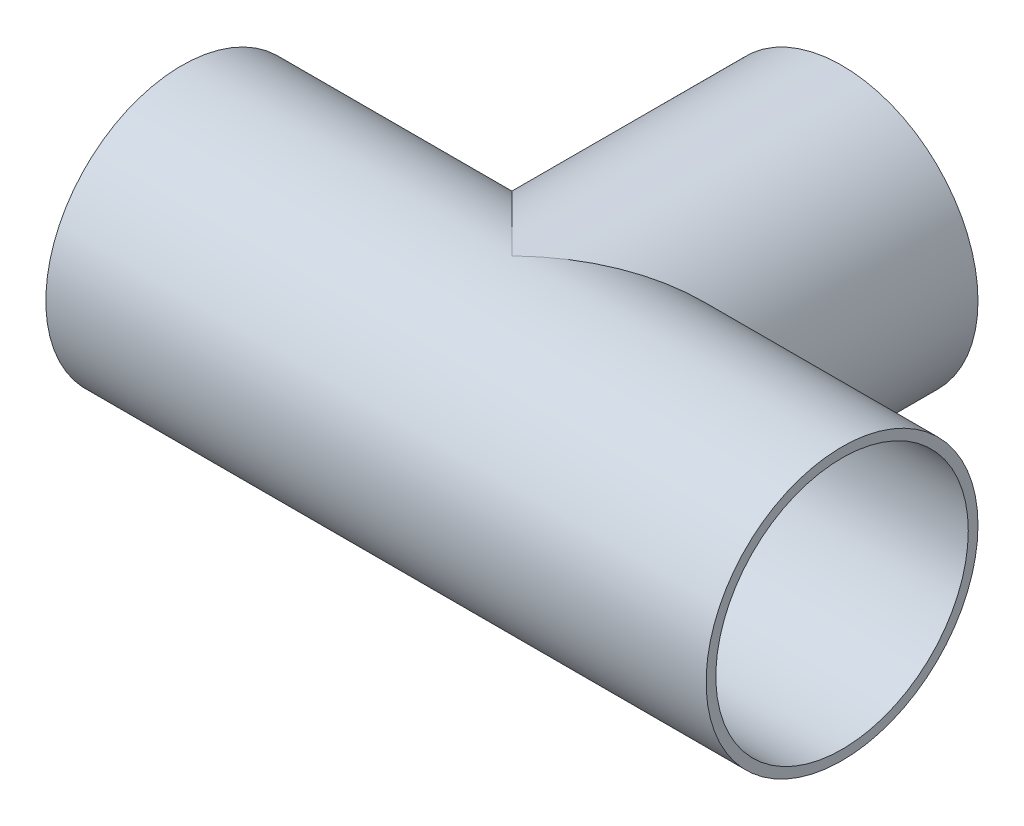
ISO-10303-21;
HEADER;
FILE_DESCRIPTION(('STEP AP214'),'2;1');
FILE_NAME('part.step','',(''),(''),'','','');
FILE_SCHEMA(('AUTOMOTIVE_DESIGN { 1 0 10303 214 1 1 1 1 }'));
ENDSEC;
DATA;
#1=APPLICATION_CONTEXT('core data for automotive mechanical design processes');
#2=APPLICATION_PROTOCOL_DEFINITION('international standard','automotive_design',2000,#1);
#3=PRODUCT_CONTEXT('',#1,'mechanical');
#4=PRODUCT('Part','Part','',(#3));
#5=PRODUCT_RELATED_PRODUCT_CATEGORY('part','',(#4));
#6=PRODUCT_DEFINITION_FORMATION('','',#4);
#7=PRODUCT_DEFINITION_CONTEXT('part definition',#1,'design');
#8=PRODUCT_DEFINITION('design','',#6,#7);
#9=PRODUCT_DEFINITION_SHAPE('','',#8);
#10=(LENGTH_UNIT() NAMED_UNIT(*) SI_UNIT(.MILLI.,.METRE.));
#11=(NAMED_UNIT(*) PLANE_ANGLE_UNIT() SI_UNIT($,.RADIAN.));
#12=(NAMED_UNIT(*) SI_UNIT($,.STERADIAN.) SOLID_ANGLE_UNIT());
#13=UNCERTAINTY_MEASURE_WITH_UNIT(LENGTH_MEASURE(1.E-05),#10,'distance_accuracy_value','');
#14=(GEOMETRIC_REPRESENTATION_CONTEXT(3) GLOBAL_UNCERTAINTY_ASSIGNED_CONTEXT((#13)) GLOBAL_UNIT_ASSIGNED_CONTEXT((#10,
#11,#12)) REPRESENTATION_CONTEXT('',''));
#15=CARTESIAN_POINT('',(0.,0.,0.));
#16=DIRECTION('',(0.,0.,1.));
#17=DIRECTION('',(1.,0.,0.));
#18=AXIS2_PLACEMENT_3D('',#15,#16,#17);
#19=CARTESIAN_POINT('',(-170.,0.,0.));
#20=DIRECTION('',(1.,0.,0.));
#21=DIRECTION('',(0.,0.,-1.));
#22=AXIS2_PLACEMENT_3D('',#19,#20,#21);
#23=CYLINDRICAL_SURFACE('',#22,35.);
#24=CARTESIAN_POINT('',(-85.,0.,0.));
#25=DIRECTION('',(0.707106781186547,0.,0.707106781186547));
#26=DIRECTION('',(0.707106781186547,0.,-0.707106781186547));
#27=AXIS2_PLACEMENT_3D('',#24,#25,#26);
#28=ELLIPSE('',#27,49.4974746830583,35.);
#29=CARTESIAN_POINT('',(-85.,35.,0.));
#30=VERTEX_POINT('',#29);
#31=CARTESIAN_POINT('',(-85.,-35.,0.));
#32=VERTEX_POINT('',#31);
#33=EDGE_CURVE('E11',#30,#32,#28,.F.);
#34=ORIENTED_EDGE('',*,*,#33,.F.);
#35=CARTESIAN_POINT('',(-85.,0.,0.));
#36=DIRECTION('',(0.707106781186547,0.,-0.707106781186547));
#37=DIRECTION('',(0.707106781186547,0.,0.707106781186547));
#38=AXIS2_PLACEMENT_3D('',#35,#36,#37);
#39=ELLIPSE('',#38,49.4974746830583,35.);
#40=EDGE_CURVE('E51',#32,#30,#39,.T.);
#41=ORIENTED_EDGE('',*,*,#40,.F.);
#42=EDGE_LOOP('',(#34,#41));
#43=FACE_BOUND('',#42,.T.);
#44=CARTESIAN_POINT('',(-170.,0.,0.));
#45=DIRECTION('',(1.,0.,0.));
#46=DIRECTION('',(0.,0.,-1.));
#47=AXIS2_PLACEMENT_3D('',#44,#45,#46);
#48=CIRCLE('',#47,35.);
#49=CARTESIAN_POINT('',(-170.,0.,-35.));
#50=VERTEX_POINT('',#49);
#51=EDGE_CURVE('E88',#50,#50,#48,.T.);
#52=ORIENTED_EDGE('',*,*,#51,.T.);
#53=EDGE_LOOP('',(#52));
#54=FACE_BOUND('',#53,.T.);
#55=CARTESIAN_POINT('',(0.,0.,0.));
#56=DIRECTION('',(1.,0.,0.));
#57=DIRECTION('',(0.,0.,-1.));
#58=AXIS2_PLACEMENT_3D('',#55,#56,#57);
#59=CIRCLE('',#58,35.);
#60=CARTESIAN_POINT('',(0.,0.,-35.));
#61=VERTEX_POINT('',#60);
#62=EDGE_CURVE('E87',#61,#61,#59,.T.);
#63=ORIENTED_EDGE('',*,*,#62,.F.);
#64=EDGE_LOOP('',(#63));
#65=FACE_BOUND('',#64,.T.);
#66=ADVANCED_FACE('F43',(#43,#54,#65),#23,.T.);
#67=CARTESIAN_POINT('',(-170.,0.,0.));
#68=DIRECTION('',(1.,0.,0.));
#69=DIRECTION('',(0.,0.,-1.));
#70=AXIS2_PLACEMENT_3D('',#67,#68,#69);
#71=PLANE('',#70);
#72=CARTESIAN_POINT('',(-170.,0.,0.));
#73=DIRECTION('',(1.,0.,0.));
#74=DIRECTION('',(0.,0.,-1.));
#75=AXIS2_PLACEMENT_3D('',#72,#73,#74);
#76=CIRCLE('',#75,32.5);
#77=CARTESIAN_POINT('',(-170.,0.,-32.5));
#78=VERTEX_POINT('',#77);
#79=EDGE_CURVE('E71',#78,#78,#76,.T.);
#80=ORIENTED_EDGE('',*,*,#79,.T.);
#81=EDGE_LOOP('',(#80));
#82=FACE_BOUND('',#81,.T.);
#83=ORIENTED_EDGE('',*,*,#51,.F.);
#84=EDGE_LOOP('',(#83));
#85=FACE_BOUND('',#84,.T.);
#86=ADVANCED_FACE('F99',(#82,#85),#71,.F.);
#87=CARTESIAN_POINT('',(0.,0.,0.));
#88=DIRECTION('',(1.,0.,0.));
#89=DIRECTION('',(0.,0.,-1.));
#90=AXIS2_PLACEMENT_3D('',#87,#88,#89);
#91=PLANE('',#90);
#92=CARTESIAN_POINT('',(0.,0.,0.));
#93=DIRECTION('',(1.,0.,0.));
#94=DIRECTION('',(0.,0.,-1.));
#95=AXIS2_PLACEMENT_3D('',#92,#93,#94);
#96=CIRCLE('',#95,32.5);
#97=CARTESIAN_POINT('',(0.,0.,-32.5));
#98=VERTEX_POINT('',#97);
#99=EDGE_CURVE('E131',#98,#98,#96,.T.);
#100=ORIENTED_EDGE('',*,*,#99,.F.);
#101=EDGE_LOOP('',(#100));
#102=FACE_BOUND('',#101,.T.);
#103=ORIENTED_EDGE('',*,*,#62,.T.);
#104=EDGE_LOOP('',(#103));
#105=FACE_BOUND('',#104,.T.);
#106=ADVANCED_FACE('F104',(#102,#105),#91,.T.);
#107=CARTESIAN_POINT('',(-85.,0.,-85.));
#108=DIRECTION('',(0.,0.,1.));
#109=DIRECTION('',(1.,0.,0.));
#110=AXIS2_PLACEMENT_3D('',#107,#108,#109);
#111=CYLINDRICAL_SURFACE('',#110,35.);
#112=CARTESIAN_POINT('',(-85.,0.,-85.));
#113=DIRECTION('',(0.,0.,1.));
#114=DIRECTION('',(1.,0.,0.));
#115=AXIS2_PLACEMENT_3D('',#112,#113,#114);
#116=CIRCLE('',#115,35.);
#117=CARTESIAN_POINT('',(-50.,0.,-85.));
#118=VERTEX_POINT('',#117);
#119=EDGE_CURVE('E80',#118,#118,#116,.T.);
#120=ORIENTED_EDGE('',*,*,#119,.T.);
#121=EDGE_LOOP('',(#120));
#122=FACE_BOUND('',#121,.T.);
#123=ORIENTED_EDGE('',*,*,#40,.T.);
#124=ORIENTED_EDGE('',*,*,#33,.T.);
#125=EDGE_LOOP('',(#123,#124));
#126=FACE_BOUND('',#125,.T.);
#127=ADVANCED_FACE('F96',(#122,#126),#111,.T.);
#128=CARTESIAN_POINT('',(-85.,0.,-85.));
#129=DIRECTION('',(0.,0.,1.));
#130=DIRECTION('',(1.,0.,0.));
#131=AXIS2_PLACEMENT_3D('',#128,#129,#130);
#132=PLANE('',#131);
#133=CARTESIAN_POINT('',(-85.,0.,-85.));
#134=DIRECTION('',(0.,0.,-1.));
#135=DIRECTION('',(-1.,0.,0.));
#136=AXIS2_PLACEMENT_3D('',#133,#134,#135);
#137=CIRCLE('',#136,32.5);
#138=CARTESIAN_POINT('',(-117.5,0.,-85.));
#139=VERTEX_POINT('',#138);
#140=EDGE_CURVE('E76',#139,#139,#137,.T.);
#141=ORIENTED_EDGE('',*,*,#140,.F.);
#142=EDGE_LOOP('',(#141));
#143=FACE_BOUND('',#142,.T.);
#144=ORIENTED_EDGE('',*,*,#119,.F.);
#145=EDGE_LOOP('',(#144));
#146=FACE_BOUND('',#145,.T.);
#147=ADVANCED_FACE('F111',(#143,#146),#132,.F.);
#148=CARTESIAN_POINT('',(-85.,0.,0.));
#149=DIRECTION('',(0.,0.,-1.));
#150=DIRECTION('',(-1.,0.,0.));
#151=AXIS2_PLACEMENT_3D('',#148,#149,#150);
#152=CYLINDRICAL_SURFACE('',#151,32.5);
#153=CARTESIAN_POINT('',(-85.,0.,0.));
#154=DIRECTION('',(-0.707106781186547,0.,-0.707106781186547));
#155=DIRECTION('',(0.707106781186547,0.,-0.707106781186547));
#156=AXIS2_PLACEMENT_3D('',#153,#154,#155);
#157=ELLIPSE('',#156,45.9619407771256,32.5);
#158=CARTESIAN_POINT('',(-85.,-32.5,0.));
#159=VERTEX_POINT('',#158);
#160=CARTESIAN_POINT('',(-85.,32.5,0.));
#161=VERTEX_POINT('',#160);
#162=EDGE_CURVE('E67',#159,#161,#157,.F.);
#163=ORIENTED_EDGE('',*,*,#162,.T.);
#164=CARTESIAN_POINT('',(-85.,0.,0.));
#165=DIRECTION('',(0.707106781186547,0.,-0.707106781186547));
#166=DIRECTION('',(-0.707106781186547,0.,-0.707106781186547));
#167=AXIS2_PLACEMENT_3D('',#164,#165,#166);
#168=ELLIPSE('',#167,45.9619407771256,32.5);
#169=EDGE_CURVE('E57',#161,#159,#168,.F.);
#170=ORIENTED_EDGE('',*,*,#169,.T.);
#171=EDGE_LOOP('',(#163,#170));
#172=FACE_BOUND('',#171,.T.);
#173=ORIENTED_EDGE('',*,*,#140,.T.);
#174=EDGE_LOOP('',(#173));
#175=FACE_BOUND('',#174,.T.);
#176=ADVANCED_FACE('F73',(#172,#175),#152,.F.);
#177=CARTESIAN_POINT('',(-170.,0.,0.));
#178=DIRECTION('',(1.,0.,0.));
#179=DIRECTION('',(0.,0.,-1.));
#180=AXIS2_PLACEMENT_3D('',#177,#178,#179);
#181=CYLINDRICAL_SURFACE('',#180,32.5);
#182=ORIENTED_EDGE('',*,*,#79,.F.);
#183=EDGE_LOOP('',(#182));
#184=FACE_BOUND('',#183,.T.);
#185=ORIENTED_EDGE('',*,*,#99,.T.);
#186=EDGE_LOOP('',(#185));
#187=FACE_BOUND('',#186,.T.);
#188=ORIENTED_EDGE('',*,*,#162,.F.);
#189=ORIENTED_EDGE('',*,*,#169,.F.);
#190=EDGE_LOOP('',(#188,#189));
#191=FACE_BOUND('',#190,.T.);
#192=ADVANCED_FACE('F68',(#184,#187,#191),#181,.F.);
#193=CLOSED_SHELL('',(#66,#86,#106,#127,#147,#176,#192));
#194=MANIFOLD_SOLID_BREP('B2',#193);
#195=ADVANCED_BREP_SHAPE_REPRESENTATION('',(#18,#194),#14);
#196=SHAPE_DEFINITION_REPRESENTATION(#9,#195);
ENDSEC;
END-ISO-10303-21;
